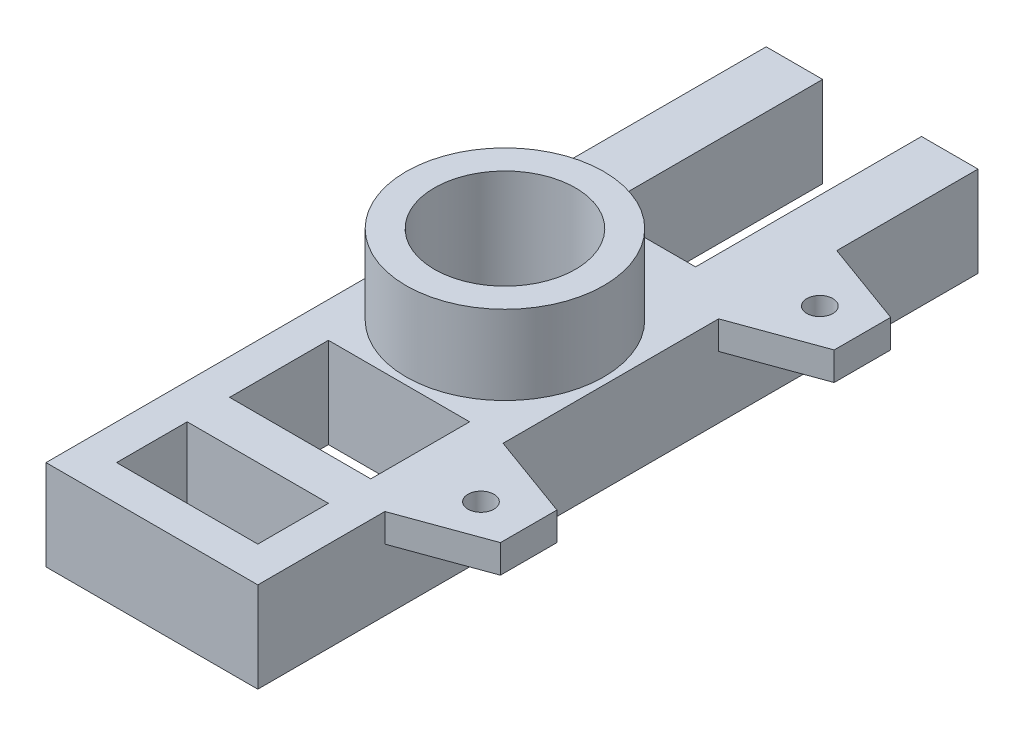
ISO-10303-21;
HEADER;
FILE_DESCRIPTION(('STEP AP214'),'2;1');
FILE_NAME('part.step','',(''),(''),'','','');
FILE_SCHEMA(('AUTOMOTIVE_DESIGN { 1 0 10303 214 1 1 1 1 }'));
ENDSEC;
DATA;
#1=APPLICATION_CONTEXT('core data for automotive mechanical design processes');
#2=APPLICATION_PROTOCOL_DEFINITION('international standard','automotive_design',2000,#1);
#3=PRODUCT_CONTEXT('',#1,'mechanical');
#4=PRODUCT('Part','Part','',(#3));
#5=PRODUCT_RELATED_PRODUCT_CATEGORY('part','',(#4));
#6=PRODUCT_DEFINITION_FORMATION('','',#4);
#7=PRODUCT_DEFINITION_CONTEXT('part definition',#1,'design');
#8=PRODUCT_DEFINITION('design','',#6,#7);
#9=PRODUCT_DEFINITION_SHAPE('','',#8);
#10=(LENGTH_UNIT() NAMED_UNIT(*) SI_UNIT(.MILLI.,.METRE.));
#11=(NAMED_UNIT(*) PLANE_ANGLE_UNIT() SI_UNIT($,.RADIAN.));
#12=(NAMED_UNIT(*) SI_UNIT($,.STERADIAN.) SOLID_ANGLE_UNIT());
#13=UNCERTAINTY_MEASURE_WITH_UNIT(LENGTH_MEASURE(1.E-05),#10,'distance_accuracy_value','');
#14=(GEOMETRIC_REPRESENTATION_CONTEXT(3) GLOBAL_UNCERTAINTY_ASSIGNED_CONTEXT((#13)) GLOBAL_UNIT_ASSIGNED_CONTEXT((#10,
#11,#12)) REPRESENTATION_CONTEXT('',''));
#15=CARTESIAN_POINT('',(0.,0.,0.));
#16=DIRECTION('',(0.,0.,1.));
#17=DIRECTION('',(1.,0.,0.));
#18=AXIS2_PLACEMENT_3D('',#15,#16,#17);
#19=CARTESIAN_POINT('',(98.4250000000001,27.94,101.6));
#20=DIRECTION('',(0.,1.,0.));
#21=DIRECTION('',(0.,0.,1.));
#22=AXIS2_PLACEMENT_3D('',#19,#20,#21);
#23=PLANE('',#22);
#24=CARTESIAN_POINT('',(65.4050000000001,27.94,76.2));
#25=DIRECTION('',(0.,1.,0.));
#26=DIRECTION('',(0.,0.,1.));
#27=AXIS2_PLACEMENT_3D('',#24,#25,#26);
#28=CIRCLE('',#27,5.842);
#29=CARTESIAN_POINT('',(65.4050000000001,27.94,82.042));
#30=VERTEX_POINT('',#29);
#31=EDGE_CURVE('E53',#30,#30,#28,.T.);
#32=ORIENTED_EDGE('',*,*,#31,.T.);
#33=EDGE_LOOP('',(#32));
#34=FACE_BOUND('',#33,.T.);
#35=DIRECTION('',(0.,0.,1.));
#36=VECTOR('',#35,1.);
#37=CARTESIAN_POINT('',(85.7250000000001,27.94,101.6));
#38=LINE('',#37,#36);
#39=CARTESIAN_POINT('',(85.7250000000001,27.94,62.3327340744577));
#40=VERTEX_POINT('',#39);
#41=CARTESIAN_POINT('',(85.7250000000001,27.94,87.7327340744577));
#42=VERTEX_POINT('',#41);
#43=EDGE_CURVE('E59',#40,#42,#38,.T.);
#44=ORIENTED_EDGE('',*,*,#43,.T.);
#45=DIRECTION('',(-0.939692620785908,0.,0.342020143325669));
#46=VECTOR('',#45,1.);
#47=CARTESIAN_POINT('',(92.4825288552221,27.94,85.2731947139619));
#48=LINE('',#47,#46);
#49=CARTESIAN_POINT('',(47.6250000000001,27.94,101.6));
#50=VERTEX_POINT('',#49);
#51=EDGE_CURVE('E11',#42,#50,#48,.T.);
#52=ORIENTED_EDGE('',*,*,#51,.T.);
#53=DIRECTION('',(0.,0.,-1.));
#54=VECTOR('',#53,1.);
#55=CARTESIAN_POINT('',(47.6250000000001,27.94,101.6));
#56=LINE('',#55,#54);
#57=CARTESIAN_POINT('',(47.6250000000001,27.94,48.4654681489155));
#58=VERTEX_POINT('',#57);
#59=EDGE_CURVE('E357',#50,#58,#56,.T.);
#60=ORIENTED_EDGE('',*,*,#59,.T.);
#61=DIRECTION('',(0.93969262078591,0.,0.342020143325665));
#62=VECTOR('',#61,1.);
#63=CARTESIAN_POINT('',(109.559638215408,27.94,71.0078329293698));
#64=LINE('',#63,#62);
#65=EDGE_CURVE('E326',#58,#40,#64,.T.);
#66=ORIENTED_EDGE('',*,*,#65,.T.);
#67=EDGE_LOOP('',(#44,#52,#60,#66));
#68=FACE_BOUND('',#67,.T.);
#69=ADVANCED_FACE('F49',(#34,#68),#23,.F.);
#70=CARTESIAN_POINT('',(47.6250000000001,40.64,0.));
#71=DIRECTION('',(-1.,0.,0.));
#72=DIRECTION('',(0.,0.,1.));
#73=AXIS2_PLACEMENT_3D('',#70,#71,#72);
#74=PLANE('',#73);
#75=DIRECTION('',(0.,1.,0.));
#76=VECTOR('',#75,1.);
#77=CARTESIAN_POINT('',(47.6250000000001,27.94,-101.6));
#78=LINE('',#77,#76);
#79=CARTESIAN_POINT('',(47.6250000000001,27.94,-101.6));
#80=VERTEX_POINT('',#79);
#81=CARTESIAN_POINT('',(47.6250000000001,40.64,-101.6));
#82=VERTEX_POINT('',#81);
#83=EDGE_CURVE('E361',#80,#82,#78,.T.);
#84=ORIENTED_EDGE('',*,*,#83,.F.);
#85=CARTESIAN_POINT('',(47.6250000000001,27.94,-48.4654681489156));
#86=VERTEX_POINT('',#85);
#87=EDGE_CURVE('E356',#86,#80,#56,.T.);
#88=ORIENTED_EDGE('',*,*,#87,.F.);
#89=DIRECTION('',(0.,1.,0.));
#90=VECTOR('',#89,1.);
#91=CARTESIAN_POINT('',(47.6250000000001,0.,-48.4654681489156));
#92=LINE('',#91,#90);
#93=CARTESIAN_POINT('',(47.6250000000001,40.64,-48.4654681489156));
#94=VERTEX_POINT('',#93);
#95=EDGE_CURVE('E484',#86,#94,#92,.T.);
#96=ORIENTED_EDGE('',*,*,#95,.T.);
#97=DIRECTION('',(0.,0.,1.));
#98=VECTOR('',#97,1.);
#99=CARTESIAN_POINT('',(47.6250000000001,40.64,-48.4654681489156));
#100=LINE('',#99,#98);
#101=CARTESIAN_POINT('',(47.6250000000001,40.64,48.4654681489155));
#102=VERTEX_POINT('',#101);
#103=EDGE_CURVE('E461',#94,#102,#100,.T.);
#104=ORIENTED_EDGE('',*,*,#103,.T.);
#105=DIRECTION('',(0.,1.,0.));
#106=VECTOR('',#105,1.);
#107=CARTESIAN_POINT('',(47.6250000000001,0.,48.4654681489155));
#108=LINE('',#107,#106);
#109=EDGE_CURVE('E480',#58,#102,#108,.T.);
#110=ORIENTED_EDGE('',*,*,#109,.F.);
#111=ORIENTED_EDGE('',*,*,#59,.F.);
#112=DIRECTION('',(0.,-1.,0.));
#113=VECTOR('',#112,1.);
#114=CARTESIAN_POINT('',(47.6250000000001,40.64,101.6));
#115=LINE('',#114,#113);
#116=CARTESIAN_POINT('',(47.6250000000001,40.64,101.6));
#117=VERTEX_POINT('',#116);
#118=EDGE_CURVE('E340',#117,#50,#115,.T.);
#119=ORIENTED_EDGE('',*,*,#118,.F.);
#120=DIRECTION('',(0.,0.,-1.));
#121=VECTOR('',#120,1.);
#122=CARTESIAN_POINT('',(47.6250000000001,40.64,0.));
#123=LINE('',#122,#121);
#124=CARTESIAN_POINT('',(47.6250000000001,40.64,158.75));
#125=VERTEX_POINT('',#124);
#126=EDGE_CURVE('E407',#125,#117,#123,.T.);
#127=ORIENTED_EDGE('',*,*,#126,.F.);
#128=DIRECTION('',(0.,-1.,0.));
#129=VECTOR('',#128,1.);
#130=CARTESIAN_POINT('',(47.6250000000001,40.64,158.75));
#131=LINE('',#130,#129);
#132=CARTESIAN_POINT('',(47.6250000000001,0.,158.75));
#133=VERTEX_POINT('',#132);
#134=EDGE_CURVE('E295',#125,#133,#131,.T.);
#135=ORIENTED_EDGE('',*,*,#134,.T.);
#136=DIRECTION('',(0.,0.,-1.));
#137=VECTOR('',#136,1.);
#138=CARTESIAN_POINT('',(47.6250000000001,0.,0.));
#139=LINE('',#138,#137);
#140=CARTESIAN_POINT('',(47.6250000000001,0.,-165.1));
#141=VERTEX_POINT('',#140);
#142=EDGE_CURVE('E246',#133,#141,#139,.T.);
#143=ORIENTED_EDGE('',*,*,#142,.T.);
#144=DIRECTION('',(0.,-1.,0.));
#145=VECTOR('',#144,1.);
#146=CARTESIAN_POINT('',(47.6250000000001,40.64,-165.1));
#147=LINE('',#146,#145);
#148=CARTESIAN_POINT('',(47.6250000000001,40.64,-165.1));
#149=VERTEX_POINT('',#148);
#150=EDGE_CURVE('E291',#149,#141,#147,.T.);
#151=ORIENTED_EDGE('',*,*,#150,.F.);
#152=EDGE_CURVE('E406',#82,#149,#123,.T.);
#153=ORIENTED_EDGE('',*,*,#152,.F.);
#154=EDGE_LOOP('',(#84,#88,#96,#104,#110,#111,#119,#127,#135,#143,#151,#153));
#155=FACE_BOUND('',#154,.T.);
#156=ADVANCED_FACE('F430',(#155),#74,.F.);
#157=CARTESIAN_POINT('',(0.,40.64,47.625));
#158=DIRECTION('',(0.,0.,-1.));
#159=DIRECTION('',(-1.,0.,0.));
#160=AXIS2_PLACEMENT_3D('',#157,#158,#159);
#161=PLANE('',#160);
#162=DIRECTION('',(1.,0.,0.));
#163=VECTOR('',#162,1.);
#164=CARTESIAN_POINT('',(0.,0.,47.625));
#165=LINE('',#164,#163);
#166=CARTESIAN_POINT('',(-31.7499999999999,0.,47.625));
#167=VERTEX_POINT('',#166);
#168=CARTESIAN_POINT('',(31.7500000000001,0.,47.625));
#169=VERTEX_POINT('',#168);
#170=EDGE_CURVE('E258',#167,#169,#165,.T.);
#171=ORIENTED_EDGE('',*,*,#170,.T.);
#172=DIRECTION('',(0.,-1.,0.));
#173=VECTOR('',#172,1.);
#174=CARTESIAN_POINT('',(31.7500000000001,40.64,47.625));
#175=LINE('',#174,#173);
#176=CARTESIAN_POINT('',(31.7500000000001,40.64,47.625));
#177=VERTEX_POINT('',#176);
#178=EDGE_CURVE('E202',#177,#169,#175,.T.);
#179=ORIENTED_EDGE('',*,*,#178,.F.);
#180=DIRECTION('',(1.,0.,0.));
#181=VECTOR('',#180,1.);
#182=CARTESIAN_POINT('',(0.,40.64,47.625));
#183=LINE('',#182,#181);
#184=CARTESIAN_POINT('',(-31.7499999999999,40.64,47.625));
#185=VERTEX_POINT('',#184);
#186=EDGE_CURVE('E188',#185,#177,#183,.T.);
#187=ORIENTED_EDGE('',*,*,#186,.F.);
#188=DIRECTION('',(0.,-1.,0.));
#189=VECTOR('',#188,1.);
#190=CARTESIAN_POINT('',(-31.7499999999999,40.64,47.625));
#191=LINE('',#190,#189);
#192=EDGE_CURVE('E76',#185,#167,#191,.T.);
#193=ORIENTED_EDGE('',*,*,#192,.T.);
#194=EDGE_LOOP('',(#171,#179,#187,#193));
#195=FACE_BOUND('',#194,.T.);
#196=ADVANCED_FACE('F588',(#195),#161,.F.);
#197=CARTESIAN_POINT('',(31.7500000000001,40.64,0.));
#198=DIRECTION('',(1.,0.,0.));
#199=DIRECTION('',(0.,0.,-1.));
#200=AXIS2_PLACEMENT_3D('',#197,#198,#199);
#201=PLANE('',#200);
#202=DIRECTION('',(0.,0.,1.));
#203=VECTOR('',#202,1.);
#204=CARTESIAN_POINT('',(31.7500000000001,0.,0.));
#205=LINE('',#204,#203);
#206=CARTESIAN_POINT('',(31.7500000000001,0.,92.075));
#207=VERTEX_POINT('',#206);
#208=EDGE_CURVE('E197',#169,#207,#205,.T.);
#209=ORIENTED_EDGE('',*,*,#208,.T.);
#210=DIRECTION('',(0.,-1.,0.));
#211=VECTOR('',#210,1.);
#212=CARTESIAN_POINT('',(31.7500000000001,40.64,92.075));
#213=LINE('',#212,#211);
#214=CARTESIAN_POINT('',(31.7500000000001,40.64,92.075));
#215=VERTEX_POINT('',#214);
#216=EDGE_CURVE('E195',#215,#207,#213,.T.);
#217=ORIENTED_EDGE('',*,*,#216,.F.);
#218=DIRECTION('',(0.,0.,1.));
#219=VECTOR('',#218,1.);
#220=CARTESIAN_POINT('',(31.7500000000001,40.64,0.));
#221=LINE('',#220,#219);
#222=EDGE_CURVE('E182',#177,#215,#221,.T.);
#223=ORIENTED_EDGE('',*,*,#222,.F.);
#224=ORIENTED_EDGE('',*,*,#178,.T.);
#225=EDGE_LOOP('',(#209,#217,#223,#224));
#226=FACE_BOUND('',#225,.T.);
#227=ADVANCED_FACE('F196',(#226),#201,.F.);
#228=CARTESIAN_POINT('',(0.,40.64,92.075));
#229=DIRECTION('',(0.,0.,-1.));
#230=DIRECTION('',(-1.,0.,0.));
#231=AXIS2_PLACEMENT_3D('',#228,#229,#230);
#232=PLANE('',#231);
#233=DIRECTION('',(1.,0.,0.));
#234=VECTOR('',#233,1.);
#235=CARTESIAN_POINT('',(0.,0.,92.075));
#236=LINE('',#235,#234);
#237=CARTESIAN_POINT('',(-31.7499999999999,0.,92.075));
#238=VERTEX_POINT('',#237);
#239=EDGE_CURVE('E263',#238,#207,#236,.T.);
#240=ORIENTED_EDGE('',*,*,#239,.F.);
#241=DIRECTION('',(0.,-1.,0.));
#242=VECTOR('',#241,1.);
#243=CARTESIAN_POINT('',(-31.7499999999999,40.64,92.075));
#244=LINE('',#243,#242);
#245=CARTESIAN_POINT('',(-31.7499999999999,40.64,92.075));
#246=VERTEX_POINT('',#245);
#247=EDGE_CURVE('E203',#246,#238,#244,.T.);
#248=ORIENTED_EDGE('',*,*,#247,.F.);
#249=DIRECTION('',(1.,0.,0.));
#250=VECTOR('',#249,1.);
#251=CARTESIAN_POINT('',(0.,40.64,92.075));
#252=LINE('',#251,#250);
#253=EDGE_CURVE('E187',#246,#215,#252,.T.);
#254=ORIENTED_EDGE('',*,*,#253,.T.);
#255=ORIENTED_EDGE('',*,*,#216,.T.);
#256=EDGE_LOOP('',(#240,#248,#254,#255));
#257=FACE_BOUND('',#256,.T.);
#258=ADVANCED_FACE('F205',(#257),#232,.T.);
#259=CARTESIAN_POINT('',(-22.2249999999999,40.64,0.));
#260=DIRECTION('',(-1.,0.,0.));
#261=DIRECTION('',(0.,0.,1.));
#262=AXIS2_PLACEMENT_3D('',#259,#260,#261);
#263=PLANE('',#262);
#264=DIRECTION('',(0.,0.,-1.));
#265=VECTOR('',#264,1.);
#266=CARTESIAN_POINT('',(-22.2249999999999,0.,0.));
#267=LINE('',#266,#265);
#268=CARTESIAN_POINT('',(-22.2249999999999,0.,-63.5));
#269=VERTEX_POINT('',#268);
#270=CARTESIAN_POINT('',(-22.2249999999999,0.,-165.1));
#271=VERTEX_POINT('',#270);
#272=EDGE_CURVE('E231',#269,#271,#267,.T.);
#273=ORIENTED_EDGE('',*,*,#272,.T.);
#274=DIRECTION('',(0.,-1.,0.));
#275=VECTOR('',#274,1.);
#276=CARTESIAN_POINT('',(-22.2249999999999,40.64,-165.1));
#277=LINE('',#276,#275);
#278=CARTESIAN_POINT('',(-22.2249999999999,40.64,-165.1));
#279=VERTEX_POINT('',#278);
#280=EDGE_CURVE('E273',#279,#271,#277,.T.);
#281=ORIENTED_EDGE('',*,*,#280,.F.);
#282=DIRECTION('',(0.,0.,-1.));
#283=VECTOR('',#282,1.);
#284=CARTESIAN_POINT('',(-22.2249999999999,40.64,0.));
#285=LINE('',#284,#283);
#286=CARTESIAN_POINT('',(-22.2249999999999,40.64,-63.5));
#287=VERTEX_POINT('',#286);
#288=EDGE_CURVE('E392',#287,#279,#285,.T.);
#289=ORIENTED_EDGE('',*,*,#288,.F.);
#290=DIRECTION('',(0.,-1.,0.));
#291=VECTOR('',#290,1.);
#292=CARTESIAN_POINT('',(-22.2249999999999,40.64,-63.5));
#293=LINE('',#292,#291);
#294=EDGE_CURVE('E279',#287,#269,#293,.T.);
#295=ORIENTED_EDGE('',*,*,#294,.T.);
#296=EDGE_LOOP('',(#273,#281,#289,#295));
#297=FACE_BOUND('',#296,.T.);
#298=ADVANCED_FACE('F567',(#297),#263,.F.);
#299=CARTESIAN_POINT('',(0.,40.64,-165.1));
#300=DIRECTION('',(0.,0.,1.));
#301=DIRECTION('',(1.,0.,0.));
#302=AXIS2_PLACEMENT_3D('',#299,#300,#301);
#303=PLANE('',#302);
#304=DIRECTION('',(-1.,0.,0.));
#305=VECTOR('',#304,1.);
#306=CARTESIAN_POINT('',(0.,0.,-165.1));
#307=LINE('',#306,#305);
#308=CARTESIAN_POINT('',(-47.6249999999999,0.,-165.1));
#309=VERTEX_POINT('',#308);
#310=EDGE_CURVE('E235',#271,#309,#307,.T.);
#311=ORIENTED_EDGE('',*,*,#310,.T.);
#312=DIRECTION('',(0.,-1.,0.));
#313=VECTOR('',#312,1.);
#314=CARTESIAN_POINT('',(-47.6249999999999,40.64,-165.1));
#315=LINE('',#314,#313);
#316=CARTESIAN_POINT('',(-47.6249999999999,40.64,-165.1));
#317=VERTEX_POINT('',#316);
#318=EDGE_CURVE('E302',#317,#309,#315,.T.);
#319=ORIENTED_EDGE('',*,*,#318,.F.);
#320=DIRECTION('',(-1.,0.,0.));
#321=VECTOR('',#320,1.);
#322=CARTESIAN_POINT('',(0.,40.64,-165.1));
#323=LINE('',#322,#321);
#324=EDGE_CURVE('E396',#279,#317,#323,.T.);
#325=ORIENTED_EDGE('',*,*,#324,.F.);
#326=ORIENTED_EDGE('',*,*,#280,.T.);
#327=EDGE_LOOP('',(#311,#319,#325,#326));
#328=FACE_BOUND('',#327,.T.);
#329=ADVANCED_FACE('F569',(#328),#303,.F.);
#330=CARTESIAN_POINT('',(-47.6249999999999,40.64,0.));
#331=DIRECTION('',(-1.,0.,0.));
#332=DIRECTION('',(0.,0.,1.));
#333=AXIS2_PLACEMENT_3D('',#330,#331,#332);
#334=PLANE('',#333);
#335=DIRECTION('',(0.,0.,-1.));
#336=VECTOR('',#335,1.);
#337=CARTESIAN_POINT('',(-47.6249999999999,0.,0.));
#338=LINE('',#337,#336);
#339=CARTESIAN_POINT('',(-47.6249999999999,0.,158.75));
#340=VERTEX_POINT('',#339);
#341=EDGE_CURVE('E239',#340,#309,#338,.T.);
#342=ORIENTED_EDGE('',*,*,#341,.F.);
#343=DIRECTION('',(0.,-1.,0.));
#344=VECTOR('',#343,1.);
#345=CARTESIAN_POINT('',(-47.6249999999999,40.64,158.75));
#346=LINE('',#345,#344);
#347=CARTESIAN_POINT('',(-47.6249999999999,40.64,158.75));
#348=VERTEX_POINT('',#347);
#349=EDGE_CURVE('E299',#348,#340,#346,.T.);
#350=ORIENTED_EDGE('',*,*,#349,.F.);
#351=DIRECTION('',(0.,0.,-1.));
#352=VECTOR('',#351,1.);
#353=CARTESIAN_POINT('',(-47.6249999999999,40.64,0.));
#354=LINE('',#353,#352);
#355=EDGE_CURVE('E399',#348,#317,#354,.T.);
#356=ORIENTED_EDGE('',*,*,#355,.T.);
#357=ORIENTED_EDGE('',*,*,#318,.T.);
#358=EDGE_LOOP('',(#342,#350,#356,#357));
#359=FACE_BOUND('',#358,.T.);
#360=ADVANCED_FACE('F572',(#359),#334,.T.);
#361=CARTESIAN_POINT('',(0.,40.64,158.75));
#362=DIRECTION('',(0.,0.,-1.));
#363=DIRECTION('',(-1.,0.,0.));
#364=AXIS2_PLACEMENT_3D('',#361,#362,#363);
#365=PLANE('',#364);
#366=DIRECTION('',(1.,0.,0.));
#367=VECTOR('',#366,1.);
#368=CARTESIAN_POINT('',(0.,0.,158.75));
#369=LINE('',#368,#367);
#370=EDGE_CURVE('E243',#340,#133,#369,.T.);
#371=ORIENTED_EDGE('',*,*,#370,.T.);
#372=ORIENTED_EDGE('',*,*,#134,.F.);
#373=DIRECTION('',(1.,0.,0.));
#374=VECTOR('',#373,1.);
#375=CARTESIAN_POINT('',(0.,40.64,158.75));
#376=LINE('',#375,#374);
#377=EDGE_CURVE('E403',#348,#125,#376,.T.);
#378=ORIENTED_EDGE('',*,*,#377,.F.);
#379=ORIENTED_EDGE('',*,*,#349,.T.);
#380=EDGE_LOOP('',(#371,#372,#378,#379));
#381=FACE_BOUND('',#380,.T.);
#382=ADVANCED_FACE('F541',(#381),#365,.F.);
#383=CARTESIAN_POINT('',(0.,40.64,-165.1));
#384=DIRECTION('',(0.,0.,1.));
#385=DIRECTION('',(1.,0.,0.));
#386=AXIS2_PLACEMENT_3D('',#383,#384,#385);
#387=PLANE('',#386);
#388=DIRECTION('',(-1.,0.,0.));
#389=VECTOR('',#388,1.);
#390=CARTESIAN_POINT('',(0.,0.,-165.1));
#391=LINE('',#390,#389);
#392=CARTESIAN_POINT('',(22.2250000000001,0.,-165.1));
#393=VERTEX_POINT('',#392);
#394=EDGE_CURVE('E249',#141,#393,#391,.T.);
#395=ORIENTED_EDGE('',*,*,#394,.T.);
#396=DIRECTION('',(0.,-1.,0.));
#397=VECTOR('',#396,1.);
#398=CARTESIAN_POINT('',(22.2250000000001,40.64,-165.1));
#399=LINE('',#398,#397);
#400=CARTESIAN_POINT('',(22.2250000000001,40.64,-165.1));
#401=VERTEX_POINT('',#400);
#402=EDGE_CURVE('E287',#401,#393,#399,.T.);
#403=ORIENTED_EDGE('',*,*,#402,.F.);
#404=DIRECTION('',(-1.,0.,0.));
#405=VECTOR('',#404,1.);
#406=CARTESIAN_POINT('',(0.,40.64,-165.1));
#407=LINE('',#406,#405);
#408=EDGE_CURVE('E411',#149,#401,#407,.T.);
#409=ORIENTED_EDGE('',*,*,#408,.F.);
#410=ORIENTED_EDGE('',*,*,#150,.T.);
#411=EDGE_LOOP('',(#395,#403,#409,#410));
#412=FACE_BOUND('',#411,.T.);
#413=ADVANCED_FACE('F554',(#412),#387,.F.);
#414=CARTESIAN_POINT('',(22.2250000000001,40.64,0.));
#415=DIRECTION('',(1.,0.,0.));
#416=DIRECTION('',(0.,0.,-1.));
#417=AXIS2_PLACEMENT_3D('',#414,#415,#416);
#418=PLANE('',#417);
#419=DIRECTION('',(0.,0.,1.));
#420=VECTOR('',#419,1.);
#421=CARTESIAN_POINT('',(22.2250000000001,0.,0.));
#422=LINE('',#421,#420);
#423=CARTESIAN_POINT('',(22.2250000000001,0.,-63.5));
#424=VERTEX_POINT('',#423);
#425=EDGE_CURVE('E252',#393,#424,#422,.T.);
#426=ORIENTED_EDGE('',*,*,#425,.T.);
#427=DIRECTION('',(0.,-1.,0.));
#428=VECTOR('',#427,1.);
#429=CARTESIAN_POINT('',(22.2250000000001,40.64,-63.5));
#430=LINE('',#429,#428);
#431=CARTESIAN_POINT('',(22.2250000000001,40.64,-63.5));
#432=VERTEX_POINT('',#431);
#433=EDGE_CURVE('E283',#432,#424,#430,.T.);
#434=ORIENTED_EDGE('',*,*,#433,.F.);
#435=DIRECTION('',(0.,0.,1.));
#436=VECTOR('',#435,1.);
#437=CARTESIAN_POINT('',(22.2250000000001,40.64,0.));
#438=LINE('',#437,#436);
#439=EDGE_CURVE('E414',#401,#432,#438,.T.);
#440=ORIENTED_EDGE('',*,*,#439,.F.);
#441=ORIENTED_EDGE('',*,*,#402,.T.);
#442=EDGE_LOOP('',(#426,#434,#440,#441));
#443=FACE_BOUND('',#442,.T.);
#444=ADVANCED_FACE('F558',(#443),#418,.F.);
#445=CARTESIAN_POINT('',(31.7500000000001,40.64,0.));
#446=DIRECTION('',(-1.,0.,0.));
#447=DIRECTION('',(0.,0.,1.));
#448=AXIS2_PLACEMENT_3D('',#445,#446,#447);
#449=PLANE('',#448);
#450=DIRECTION('',(0.,0.,-1.));
#451=VECTOR('',#450,1.);
#452=CARTESIAN_POINT('',(31.7500000000001,0.,0.));
#453=LINE('',#452,#451);
#454=CARTESIAN_POINT('',(31.7500000000001,0.,142.875));
#455=VERTEX_POINT('',#454);
#456=CARTESIAN_POINT('',(31.7500000000001,0.,111.125));
#457=VERTEX_POINT('',#456);
#458=EDGE_CURVE('E214',#455,#457,#453,.T.);
#459=ORIENTED_EDGE('',*,*,#458,.F.);
#460=DIRECTION('',(0.,-1.,0.));
#461=VECTOR('',#460,1.);
#462=CARTESIAN_POINT('',(31.7500000000001,40.64,142.875));
#463=LINE('',#462,#461);
#464=CARTESIAN_POINT('',(31.7500000000001,40.64,142.875));
#465=VERTEX_POINT('',#464);
#466=EDGE_CURVE('E139',#465,#455,#463,.T.);
#467=ORIENTED_EDGE('',*,*,#466,.F.);
#468=DIRECTION('',(0.,0.,-1.));
#469=VECTOR('',#468,1.);
#470=CARTESIAN_POINT('',(31.7500000000001,40.64,0.));
#471=LINE('',#470,#469);
#472=CARTESIAN_POINT('',(31.7500000000001,40.64,111.125));
#473=VERTEX_POINT('',#472);
#474=EDGE_CURVE('E378',#465,#473,#471,.T.);
#475=ORIENTED_EDGE('',*,*,#474,.T.);
#476=DIRECTION('',(0.,-1.,0.));
#477=VECTOR('',#476,1.);
#478=CARTESIAN_POINT('',(31.7500000000001,40.64,111.125));
#479=LINE('',#478,#477);
#480=EDGE_CURVE('E210',#473,#457,#479,.T.);
#481=ORIENTED_EDGE('',*,*,#480,.T.);
#482=EDGE_LOOP('',(#459,#467,#475,#481));
#483=FACE_BOUND('',#482,.T.);
#484=ADVANCED_FACE('F51',(#483),#449,.T.);
#485=CARTESIAN_POINT('',(0.,40.64,142.875));
#486=DIRECTION('',(0.,0.,-1.));
#487=DIRECTION('',(-1.,0.,0.));
#488=AXIS2_PLACEMENT_3D('',#485,#486,#487);
#489=PLANE('',#488);
#490=DIRECTION('',(1.,0.,0.));
#491=VECTOR('',#490,1.);
#492=CARTESIAN_POINT('',(0.,0.,142.875));
#493=LINE('',#492,#491);
#494=CARTESIAN_POINT('',(-31.7499999999999,0.,142.875));
#495=VERTEX_POINT('',#494);
#496=EDGE_CURVE('E218',#495,#455,#493,.T.);
#497=ORIENTED_EDGE('',*,*,#496,.F.);
#498=DIRECTION('',(0.,-1.,0.));
#499=VECTOR('',#498,1.);
#500=CARTESIAN_POINT('',(-31.7499999999999,40.64,142.875));
#501=LINE('',#500,#499);
#502=CARTESIAN_POINT('',(-31.7499999999999,40.64,142.875));
#503=VERTEX_POINT('',#502);
#504=EDGE_CURVE('E314',#503,#495,#501,.T.);
#505=ORIENTED_EDGE('',*,*,#504,.F.);
#506=DIRECTION('',(1.,0.,0.));
#507=VECTOR('',#506,1.);
#508=CARTESIAN_POINT('',(0.,40.64,142.875));
#509=LINE('',#508,#507);
#510=EDGE_CURVE('E381',#503,#465,#509,.T.);
#511=ORIENTED_EDGE('',*,*,#510,.T.);
#512=ORIENTED_EDGE('',*,*,#466,.T.);
#513=EDGE_LOOP('',(#497,#505,#511,#512));
#514=FACE_BOUND('',#513,.T.);
#515=ADVANCED_FACE('F650',(#514),#489,.T.);
#516=CARTESIAN_POINT('',(-31.7499999999999,40.64,0.));
#517=DIRECTION('',(-1.,0.,0.));
#518=DIRECTION('',(0.,0.,1.));
#519=AXIS2_PLACEMENT_3D('',#516,#517,#518);
#520=PLANE('',#519);
#521=DIRECTION('',(0.,0.,-1.));
#522=VECTOR('',#521,1.);
#523=CARTESIAN_POINT('',(-31.7499999999999,0.,0.));
#524=LINE('',#523,#522);
#525=CARTESIAN_POINT('',(-31.7499999999999,0.,111.125));
#526=VERTEX_POINT('',#525);
#527=EDGE_CURVE('E223',#495,#526,#524,.T.);
#528=ORIENTED_EDGE('',*,*,#527,.T.);
#529=DIRECTION('',(0.,-1.,0.));
#530=VECTOR('',#529,1.);
#531=CARTESIAN_POINT('',(-31.7499999999999,40.64,111.125));
#532=LINE('',#531,#530);
#533=CARTESIAN_POINT('',(-31.7499999999999,40.64,111.125));
#534=VERTEX_POINT('',#533);
#535=EDGE_CURVE('E310',#534,#526,#532,.T.);
#536=ORIENTED_EDGE('',*,*,#535,.F.);
#537=DIRECTION('',(0.,0.,-1.));
#538=VECTOR('',#537,1.);
#539=CARTESIAN_POINT('',(-31.7499999999999,40.64,0.));
#540=LINE('',#539,#538);
#541=EDGE_CURVE('E385',#503,#534,#540,.T.);
#542=ORIENTED_EDGE('',*,*,#541,.F.);
#543=ORIENTED_EDGE('',*,*,#504,.T.);
#544=EDGE_LOOP('',(#528,#536,#542,#543));
#545=FACE_BOUND('',#544,.T.);
#546=ADVANCED_FACE('F630',(#545),#520,.F.);
#547=CARTESIAN_POINT('',(0.,40.64,-63.5));
#548=DIRECTION('',(0.,0.,1.));
#549=DIRECTION('',(1.,0.,0.));
#550=AXIS2_PLACEMENT_3D('',#547,#548,#549);
#551=PLANE('',#550);
#552=DIRECTION('',(-1.,0.,0.));
#553=VECTOR('',#552,1.);
#554=CARTESIAN_POINT('',(0.,0.,-63.5));
#555=LINE('',#554,#553);
#556=EDGE_CURVE('E255',#424,#269,#555,.T.);
#557=ORIENTED_EDGE('',*,*,#556,.T.);
#558=ORIENTED_EDGE('',*,*,#294,.F.);
#559=DIRECTION('',(-1.,0.,0.));
#560=VECTOR('',#559,1.);
#561=CARTESIAN_POINT('',(0.,40.64,-63.5));
#562=LINE('',#561,#560);
#563=EDGE_CURVE('E417',#432,#287,#562,.T.);
#564=ORIENTED_EDGE('',*,*,#563,.F.);
#565=ORIENTED_EDGE('',*,*,#433,.T.);
#566=EDGE_LOOP('',(#557,#558,#564,#565));
#567=FACE_BOUND('',#566,.T.);
#568=ADVANCED_FACE('F565',(#567),#551,.F.);
#569=CARTESIAN_POINT('',(0.,40.64,111.125));
#570=DIRECTION('',(0.,0.,-1.));
#571=DIRECTION('',(-1.,0.,0.));
#572=AXIS2_PLACEMENT_3D('',#569,#570,#571);
#573=PLANE('',#572);
#574=DIRECTION('',(1.,0.,0.));
#575=VECTOR('',#574,1.);
#576=CARTESIAN_POINT('',(0.,0.,111.125));
#577=LINE('',#576,#575);
#578=EDGE_CURVE('E227',#526,#457,#577,.T.);
#579=ORIENTED_EDGE('',*,*,#578,.T.);
#580=ORIENTED_EDGE('',*,*,#480,.F.);
#581=DIRECTION('',(1.,0.,0.));
#582=VECTOR('',#581,1.);
#583=CARTESIAN_POINT('',(0.,40.64,111.125));
#584=LINE('',#583,#582);
#585=EDGE_CURVE('E389',#534,#473,#584,.T.);
#586=ORIENTED_EDGE('',*,*,#585,.F.);
#587=ORIENTED_EDGE('',*,*,#535,.T.);
#588=EDGE_LOOP('',(#579,#580,#586,#587));
#589=FACE_BOUND('',#588,.T.);
#590=ADVANCED_FACE('F621',(#589),#573,.F.);
#591=CARTESIAN_POINT('',(-31.7499999999999,40.64,0.));
#592=DIRECTION('',(1.,0.,0.));
#593=DIRECTION('',(0.,0.,-1.));
#594=AXIS2_PLACEMENT_3D('',#591,#592,#593);
#595=PLANE('',#594);
#596=DIRECTION('',(0.,0.,1.));
#597=VECTOR('',#596,1.);
#598=CARTESIAN_POINT('',(-31.7499999999999,0.,0.));
#599=LINE('',#598,#597);
#600=EDGE_CURVE('E266',#167,#238,#599,.T.);
#601=ORIENTED_EDGE('',*,*,#600,.F.);
#602=ORIENTED_EDGE('',*,*,#192,.F.);
#603=DIRECTION('',(0.,0.,1.));
#604=VECTOR('',#603,1.);
#605=CARTESIAN_POINT('',(-31.7499999999999,40.64,0.));
#606=LINE('',#605,#604);
#607=EDGE_CURVE('E207',#185,#246,#606,.T.);
#608=ORIENTED_EDGE('',*,*,#607,.T.);
#609=ORIENTED_EDGE('',*,*,#247,.T.);
#610=EDGE_LOOP('',(#601,#602,#608,#609));
#611=FACE_BOUND('',#610,.T.);
#612=ADVANCED_FACE('F615',(#611),#595,.T.);
#613=CARTESIAN_POINT('',(0.,40.64,0.));
#614=DIRECTION('',(0.,1.,0.));
#615=DIRECTION('',(0.,0.,1.));
#616=AXIS2_PLACEMENT_3D('',#613,#614,#615);
#617=PLANE('',#616);
#618=CARTESIAN_POINT('',(65.4050000000001,40.64,76.2));
#619=DIRECTION('',(0.,1.,0.));
#620=DIRECTION('',(0.,0.,1.));
#621=AXIS2_PLACEMENT_3D('',#618,#619,#620);
#622=CIRCLE('',#621,5.842);
#623=CARTESIAN_POINT('',(65.4050000000001,40.64,82.042));
#624=VERTEX_POINT('',#623);
#625=EDGE_CURVE('E454',#624,#624,#622,.T.);
#626=ORIENTED_EDGE('',*,*,#625,.F.);
#627=EDGE_LOOP('',(#626));
#628=FACE_BOUND('',#627,.T.);
#629=CARTESIAN_POINT('',(65.4050000000001,40.64,-76.2));
#630=DIRECTION('',(0.,1.,0.));
#631=DIRECTION('',(0.,0.,1.));
#632=AXIS2_PLACEMENT_3D('',#629,#630,#631);
#633=CIRCLE('',#632,5.842);
#634=CARTESIAN_POINT('',(65.4050000000001,40.64,-70.358));
#635=VERTEX_POINT('',#634);
#636=EDGE_CURVE('E447',#635,#635,#633,.T.);
#637=ORIENTED_EDGE('',*,*,#636,.F.);
#638=EDGE_LOOP('',(#637));
#639=FACE_BOUND('',#638,.T.);
#640=DIRECTION('',(-0.939692620785908,0.,0.342020143325669));
#641=VECTOR('',#640,1.);
#642=CARTESIAN_POINT('',(85.7250000000001,40.64,87.7327340744577));
#643=LINE('',#642,#641);
#644=CARTESIAN_POINT('',(85.7250000000001,40.64,87.7327340744577));
#645=VERTEX_POINT('',#644);
#646=EDGE_CURVE('E473',#645,#117,#643,.T.);
#647=ORIENTED_EDGE('',*,*,#646,.F.);
#648=DIRECTION('',(0.,0.,1.));
#649=VECTOR('',#648,1.);
#650=CARTESIAN_POINT('',(85.7250000000001,40.64,62.3327340744577));
#651=LINE('',#650,#649);
#652=CARTESIAN_POINT('',(85.7250000000001,40.64,62.3327340744577));
#653=VERTEX_POINT('',#652);
#654=EDGE_CURVE('E469',#653,#645,#651,.T.);
#655=ORIENTED_EDGE('',*,*,#654,.F.);
#656=DIRECTION('',(0.93969262078591,0.,0.342020143325665));
#657=VECTOR('',#656,1.);
#658=CARTESIAN_POINT('',(47.6250000000001,40.64,48.4654681489155));
#659=LINE('',#658,#657);
#660=EDGE_CURVE('E465',#102,#653,#659,.T.);
#661=ORIENTED_EDGE('',*,*,#660,.F.);
#662=ORIENTED_EDGE('',*,*,#103,.F.);
#663=DIRECTION('',(-0.939692620785908,0.,0.34202014332567));
#664=VECTOR('',#663,1.);
#665=CARTESIAN_POINT('',(85.7250000000001,40.64,-62.3327340744579));
#666=LINE('',#665,#664);
#667=CARTESIAN_POINT('',(85.7250000000001,40.64,-62.3327340744579));
#668=VERTEX_POINT('',#667);
#669=EDGE_CURVE('E451',#668,#94,#666,.T.);
#670=ORIENTED_EDGE('',*,*,#669,.F.);
#671=DIRECTION('',(0.,0.,1.));
#672=VECTOR('',#671,1.);
#673=CARTESIAN_POINT('',(85.7250000000001,40.64,-87.732734074458));
#674=LINE('',#673,#672);
#675=CARTESIAN_POINT('',(85.7250000000001,40.64,-87.732734074458));
#676=VERTEX_POINT('',#675);
#677=EDGE_CURVE('E445',#676,#668,#674,.T.);
#678=ORIENTED_EDGE('',*,*,#677,.F.);
#679=DIRECTION('',(0.939692620785911,0.,0.342020143325663));
#680=VECTOR('',#679,1.);
#681=CARTESIAN_POINT('',(47.6250000000001,40.64,-101.6));
#682=LINE('',#681,#680);
#683=EDGE_CURVE('E437',#82,#676,#682,.T.);
#684=ORIENTED_EDGE('',*,*,#683,.F.);
#685=ORIENTED_EDGE('',*,*,#152,.T.);
#686=ORIENTED_EDGE('',*,*,#408,.T.);
#687=ORIENTED_EDGE('',*,*,#439,.T.);
#688=ORIENTED_EDGE('',*,*,#563,.T.);
#689=ORIENTED_EDGE('',*,*,#288,.T.);
#690=ORIENTED_EDGE('',*,*,#324,.T.);
#691=ORIENTED_EDGE('',*,*,#355,.F.);
#692=ORIENTED_EDGE('',*,*,#377,.T.);
#693=ORIENTED_EDGE('',*,*,#126,.T.);
#694=EDGE_LOOP('',(#647,#655,#661,#662,#670,#678,#684,#685,#686,#687,#688,#689,#690,#691,#692,#693));
#695=FACE_BOUND('',#694,.T.);
#696=CARTESIAN_POINT('',(0.,40.64,0.));
#697=DIRECTION('',(0.,1.,0.));
#698=DIRECTION('',(0.,0.,1.));
#699=AXIS2_PLACEMENT_3D('',#696,#697,#698);
#700=CIRCLE('',#699,44.45);
#701=CARTESIAN_POINT('',(0.,40.64,44.45));
#702=VERTEX_POINT('',#701);
#703=EDGE_CURVE('E270',#702,#702,#700,.T.);
#704=ORIENTED_EDGE('',*,*,#703,.F.);
#705=EDGE_LOOP('',(#704));
#706=FACE_BOUND('',#705,.T.);
#707=ORIENTED_EDGE('',*,*,#474,.F.);
#708=ORIENTED_EDGE('',*,*,#510,.F.);
#709=ORIENTED_EDGE('',*,*,#541,.T.);
#710=ORIENTED_EDGE('',*,*,#585,.T.);
#711=EDGE_LOOP('',(#707,#708,#709,#710));
#712=FACE_BOUND('',#711,.T.);
#713=ORIENTED_EDGE('',*,*,#186,.T.);
#714=ORIENTED_EDGE('',*,*,#222,.T.);
#715=ORIENTED_EDGE('',*,*,#253,.F.);
#716=ORIENTED_EDGE('',*,*,#607,.F.);
#717=EDGE_LOOP('',(#713,#714,#715,#716));
#718=FACE_BOUND('',#717,.T.);
#719=ADVANCED_FACE('F184',(#628,#639,#695,#706,#712,#718),#617,.T.);
#720=CARTESIAN_POINT('',(0.,0.,0.));
#721=DIRECTION('',(0.,1.,0.));
#722=DIRECTION('',(0.,0.,1.));
#723=AXIS2_PLACEMENT_3D('',#720,#721,#722);
#724=PLANE('',#723);
#725=ORIENTED_EDGE('',*,*,#458,.T.);
#726=ORIENTED_EDGE('',*,*,#578,.F.);
#727=ORIENTED_EDGE('',*,*,#527,.F.);
#728=ORIENTED_EDGE('',*,*,#496,.T.);
#729=EDGE_LOOP('',(#725,#726,#727,#728));
#730=FACE_BOUND('',#729,.T.);
#731=ORIENTED_EDGE('',*,*,#272,.F.);
#732=ORIENTED_EDGE('',*,*,#556,.F.);
#733=ORIENTED_EDGE('',*,*,#425,.F.);
#734=ORIENTED_EDGE('',*,*,#394,.F.);
#735=ORIENTED_EDGE('',*,*,#142,.F.);
#736=ORIENTED_EDGE('',*,*,#370,.F.);
#737=ORIENTED_EDGE('',*,*,#341,.T.);
#738=ORIENTED_EDGE('',*,*,#310,.F.);
#739=EDGE_LOOP('',(#731,#732,#733,#734,#735,#736,#737,#738));
#740=FACE_BOUND('',#739,.T.);
#741=ORIENTED_EDGE('',*,*,#170,.F.);
#742=ORIENTED_EDGE('',*,*,#600,.T.);
#743=ORIENTED_EDGE('',*,*,#239,.T.);
#744=ORIENTED_EDGE('',*,*,#208,.F.);
#745=EDGE_LOOP('',(#741,#742,#743,#744));
#746=FACE_BOUND('',#745,.T.);
#747=CARTESIAN_POINT('',(0.,0.,0.));
#748=DIRECTION('',(0.,1.,0.));
#749=DIRECTION('',(0.,0.,1.));
#750=AXIS2_PLACEMENT_3D('',#747,#748,#749);
#751=CIRCLE('',#750,31.75);
#752=CARTESIAN_POINT('',(0.,0.,31.75));
#753=VERTEX_POINT('',#752);
#754=EDGE_CURVE('E364',#753,#753,#751,.T.);
#755=ORIENTED_EDGE('',*,*,#754,.T.);
#756=EDGE_LOOP('',(#755));
#757=FACE_BOUND('',#756,.T.);
#758=ADVANCED_FACE('F547',(#730,#740,#746,#757),#724,.F.);
#759=CARTESIAN_POINT('',(0.,76.2,0.));
#760=DIRECTION('',(0.,-1.,0.));
#761=DIRECTION('',(0.,0.,-1.));
#762=AXIS2_PLACEMENT_3D('',#759,#760,#761);
#763=CYLINDRICAL_SURFACE('',#762,31.75);
#764=CARTESIAN_POINT('',(0.,76.2,0.));
#765=DIRECTION('',(0.,1.,0.));
#766=DIRECTION('',(0.,0.,1.));
#767=AXIS2_PLACEMENT_3D('',#764,#765,#766);
#768=CIRCLE('',#767,31.75);
#769=CARTESIAN_POINT('',(0.,76.2,31.75));
#770=VERTEX_POINT('',#769);
#771=EDGE_CURVE('E365',#770,#770,#768,.T.);
#772=ORIENTED_EDGE('',*,*,#771,.T.);
#773=EDGE_LOOP('',(#772));
#774=FACE_BOUND('',#773,.T.);
#775=ORIENTED_EDGE('',*,*,#754,.F.);
#776=EDGE_LOOP('',(#775));
#777=FACE_BOUND('',#776,.T.);
#778=ADVANCED_FACE('F604',(#774,#777),#763,.F.);
#779=CARTESIAN_POINT('',(0.,76.2,0.));
#780=DIRECTION('',(0.,-1.,0.));
#781=DIRECTION('',(0.,0.,-1.));
#782=AXIS2_PLACEMENT_3D('',#779,#780,#781);
#783=CYLINDRICAL_SURFACE('',#782,44.45);
#784=ORIENTED_EDGE('',*,*,#703,.T.);
#785=EDGE_LOOP('',(#784));
#786=FACE_BOUND('',#785,.T.);
#787=CARTESIAN_POINT('',(0.,76.2,0.));
#788=DIRECTION('',(0.,1.,0.));
#789=DIRECTION('',(0.,0.,1.));
#790=AXIS2_PLACEMENT_3D('',#787,#788,#789);
#791=CIRCLE('',#790,44.45);
#792=CARTESIAN_POINT('',(0.,76.2,44.45));
#793=VERTEX_POINT('',#792);
#794=EDGE_CURVE('E219',#793,#793,#791,.T.);
#795=ORIENTED_EDGE('',*,*,#794,.F.);
#796=EDGE_LOOP('',(#795));
#797=FACE_BOUND('',#796,.T.);
#798=ADVANCED_FACE('F599',(#786,#797),#783,.T.);
#799=CARTESIAN_POINT('',(0.,76.2,0.));
#800=DIRECTION('',(0.,1.,0.));
#801=DIRECTION('',(0.,0.,1.));
#802=AXIS2_PLACEMENT_3D('',#799,#800,#801);
#803=PLANE('',#802);
#804=ORIENTED_EDGE('',*,*,#771,.F.);
#805=EDGE_LOOP('',(#804));
#806=FACE_BOUND('',#805,.T.);
#807=ORIENTED_EDGE('',*,*,#794,.T.);
#808=EDGE_LOOP('',(#807));
#809=FACE_BOUND('',#808,.T.);
#810=ADVANCED_FACE('F593',(#806,#809),#803,.T.);
#811=CARTESIAN_POINT('',(65.4050000000001,27.94,-76.2));
#812=DIRECTION('',(0.,1.,0.));
#813=DIRECTION('',(0.,0.,1.));
#814=AXIS2_PLACEMENT_3D('',#811,#812,#813);
#815=CIRCLE('',#814,5.842);
#816=CARTESIAN_POINT('',(65.4050000000001,27.94,-70.358));
#817=VERTEX_POINT('',#816);
#818=EDGE_CURVE('E332',#817,#817,#815,.T.);
#819=ORIENTED_EDGE('',*,*,#818,.T.);
#820=EDGE_LOOP('',(#819));
#821=FACE_BOUND('',#820,.T.);
#822=DIRECTION('',(0.,0.,1.));
#823=VECTOR('',#822,1.);
#824=CARTESIAN_POINT('',(85.7250000000001,27.94,101.6));
#825=LINE('',#824,#823);
#826=CARTESIAN_POINT('',(85.7250000000001,27.94,-87.732734074458));
#827=VERTEX_POINT('',#826);
#828=CARTESIAN_POINT('',(85.7250000000001,27.94,-62.3327340744579));
#829=VERTEX_POINT('',#828);
#830=EDGE_CURVE('E278',#827,#829,#825,.T.);
#831=ORIENTED_EDGE('',*,*,#830,.T.);
#832=DIRECTION('',(-0.939692620785908,0.,0.34202014332567));
#833=VECTOR('',#832,1.);
#834=CARTESIAN_POINT('',(44.2524170712555,27.94,-47.2379483502582));
#835=LINE('',#834,#833);
#836=EDGE_CURVE('E322',#829,#86,#835,.T.);
#837=ORIENTED_EDGE('',*,*,#836,.T.);
#838=ORIENTED_EDGE('',*,*,#87,.T.);
#839=DIRECTION('',(0.939692620785911,0.,0.342020143325663));
#840=VECTOR('',#839,1.);
#841=CARTESIAN_POINT('',(157.789749999374,27.94,-61.5033101348511));
#842=LINE('',#841,#840);
#843=EDGE_CURVE('E67',#80,#827,#842,.T.);
#844=ORIENTED_EDGE('',*,*,#843,.T.);
#845=EDGE_LOOP('',(#831,#837,#838,#844));
#846=FACE_BOUND('',#845,.T.);
#847=ADVANCED_FACE('F424',(#821,#846),#23,.F.);
#848=CARTESIAN_POINT('',(85.7250000000001,0.,87.7327340744577));
#849=DIRECTION('',(-0.342020143325669,0.,-0.939692620785908));
#850=DIRECTION('',(-0.939692620785908,0.,0.342020143325669));
#851=AXIS2_PLACEMENT_3D('',#848,#849,#850);
#852=PLANE('',#851);
#853=DIRECTION('',(0.,1.,0.));
#854=VECTOR('',#853,1.);
#855=CARTESIAN_POINT('',(85.7250000000001,0.,87.7327340744577));
#856=LINE('',#855,#854);
#857=EDGE_CURVE('E341',#42,#645,#856,.T.);
#858=ORIENTED_EDGE('',*,*,#857,.T.);
#859=ORIENTED_EDGE('',*,*,#646,.T.);
#860=ORIENTED_EDGE('',*,*,#118,.T.);
#861=ORIENTED_EDGE('',*,*,#51,.F.);
#862=EDGE_LOOP('',(#858,#859,#860,#861));
#863=FACE_BOUND('',#862,.T.);
#864=ADVANCED_FACE('F517',(#863),#852,.F.);
#865=CARTESIAN_POINT('',(85.7250000000001,0.,62.3327340744577));
#866=DIRECTION('',(-1.,0.,0.));
#867=DIRECTION('',(0.,0.,1.));
#868=AXIS2_PLACEMENT_3D('',#865,#866,#867);
#869=PLANE('',#868);
#870=DIRECTION('',(0.,1.,0.));
#871=VECTOR('',#870,1.);
#872=CARTESIAN_POINT('',(85.7250000000001,0.,62.3327340744577));
#873=LINE('',#872,#871);
#874=EDGE_CURVE('E347',#40,#653,#873,.T.);
#875=ORIENTED_EDGE('',*,*,#874,.T.);
#876=ORIENTED_EDGE('',*,*,#654,.T.);
#877=ORIENTED_EDGE('',*,*,#857,.F.);
#878=ORIENTED_EDGE('',*,*,#43,.F.);
#879=EDGE_LOOP('',(#875,#876,#877,#878));
#880=FACE_BOUND('',#879,.T.);
#881=ADVANCED_FACE('F522',(#880),#869,.F.);
#882=CARTESIAN_POINT('',(47.6250000000001,0.,48.4654681489155));
#883=DIRECTION('',(-0.342020143325665,0.,0.939692620785909));
#884=DIRECTION('',(0.93969262078591,0.,0.342020143325665));
#885=AXIS2_PLACEMENT_3D('',#882,#883,#884);
#886=PLANE('',#885);
#887=ORIENTED_EDGE('',*,*,#109,.T.);
#888=ORIENTED_EDGE('',*,*,#660,.T.);
#889=ORIENTED_EDGE('',*,*,#874,.F.);
#890=ORIENTED_EDGE('',*,*,#65,.F.);
#891=EDGE_LOOP('',(#887,#888,#889,#890));
#892=FACE_BOUND('',#891,.T.);
#893=ADVANCED_FACE('F526',(#892),#886,.F.);
#894=CARTESIAN_POINT('',(85.7250000000001,0.,-62.3327340744579));
#895=DIRECTION('',(-0.34202014332567,0.,-0.939692620785908));
#896=DIRECTION('',(-0.939692620785908,0.,0.34202014332567));
#897=AXIS2_PLACEMENT_3D('',#894,#895,#896);
#898=PLANE('',#897);
#899=DIRECTION('',(0.,1.,0.));
#900=VECTOR('',#899,1.);
#901=CARTESIAN_POINT('',(85.7250000000001,0.,-62.3327340744579));
#902=LINE('',#901,#900);
#903=EDGE_CURVE('E486',#829,#668,#902,.T.);
#904=ORIENTED_EDGE('',*,*,#903,.T.);
#905=ORIENTED_EDGE('',*,*,#669,.T.);
#906=ORIENTED_EDGE('',*,*,#95,.F.);
#907=ORIENTED_EDGE('',*,*,#836,.F.);
#908=EDGE_LOOP('',(#904,#905,#906,#907));
#909=FACE_BOUND('',#908,.T.);
#910=ADVANCED_FACE('F754',(#909),#898,.F.);
#911=CARTESIAN_POINT('',(85.7250000000001,0.,-87.732734074458));
#912=DIRECTION('',(-1.,0.,0.));
#913=DIRECTION('',(0.,0.,1.));
#914=AXIS2_PLACEMENT_3D('',#911,#912,#913);
#915=PLANE('',#914);
#916=DIRECTION('',(0.,1.,0.));
#917=VECTOR('',#916,1.);
#918=CARTESIAN_POINT('',(85.7250000000001,0.,-87.732734074458));
#919=LINE('',#918,#917);
#920=EDGE_CURVE('E351',#827,#676,#919,.T.);
#921=ORIENTED_EDGE('',*,*,#920,.T.);
#922=ORIENTED_EDGE('',*,*,#677,.T.);
#923=ORIENTED_EDGE('',*,*,#903,.F.);
#924=ORIENTED_EDGE('',*,*,#830,.F.);
#925=EDGE_LOOP('',(#921,#922,#923,#924));
#926=FACE_BOUND('',#925,.T.);
#927=ADVANCED_FACE('F496',(#926),#915,.F.);
#928=CARTESIAN_POINT('',(47.6250000000001,0.,-101.6));
#929=DIRECTION('',(-0.342020143325663,0.,0.939692620785911));
#930=DIRECTION('',(0.939692620785911,0.,0.342020143325663));
#931=AXIS2_PLACEMENT_3D('',#928,#929,#930);
#932=PLANE('',#931);
#933=ORIENTED_EDGE('',*,*,#83,.T.);
#934=ORIENTED_EDGE('',*,*,#683,.T.);
#935=ORIENTED_EDGE('',*,*,#920,.F.);
#936=ORIENTED_EDGE('',*,*,#843,.F.);
#937=EDGE_LOOP('',(#933,#934,#935,#936));
#938=FACE_BOUND('',#937,.T.);
#939=ADVANCED_FACE('F435',(#938),#932,.F.);
#940=CARTESIAN_POINT('',(65.4050000000001,0.,-76.2));
#941=DIRECTION('',(0.,1.,0.));
#942=DIRECTION('',(0.,0.,1.));
#943=AXIS2_PLACEMENT_3D('',#940,#941,#942);
#944=CYLINDRICAL_SURFACE('',#943,5.842);
#945=ORIENTED_EDGE('',*,*,#636,.T.);
#946=EDGE_LOOP('',(#945));
#947=FACE_BOUND('',#946,.T.);
#948=ORIENTED_EDGE('',*,*,#818,.F.);
#949=EDGE_LOOP('',(#948));
#950=FACE_BOUND('',#949,.T.);
#951=ADVANCED_FACE('F779',(#947,#950),#944,.F.);
#952=CARTESIAN_POINT('',(65.4050000000001,0.,76.2));
#953=DIRECTION('',(0.,1.,0.));
#954=DIRECTION('',(0.,0.,1.));
#955=AXIS2_PLACEMENT_3D('',#952,#953,#954);
#956=CYLINDRICAL_SURFACE('',#955,5.842);
#957=ORIENTED_EDGE('',*,*,#625,.T.);
#958=EDGE_LOOP('',(#957));
#959=FACE_BOUND('',#958,.T.);
#960=ORIENTED_EDGE('',*,*,#31,.F.);
#961=EDGE_LOOP('',(#960));
#962=FACE_BOUND('',#961,.T.);
#963=ADVANCED_FACE('F787',(#959,#962),#956,.F.);
#964=CLOSED_SHELL('',(#69,#156,#196,#227,#258,#298,#329,#360,#382,#413,#444,#484,#515,#546,#568,
#590,#612,#719,#758,#778,#798,#810,#847,#864,#881,#893,#910,#927,#939,#951,#963));
#965=MANIFOLD_SOLID_BREP('B2',#964);
#966=ADVANCED_BREP_SHAPE_REPRESENTATION('',(#18,#965),#14);
#967=SHAPE_DEFINITION_REPRESENTATION(#9,#966);
ENDSEC;
END-ISO-10303-21;
